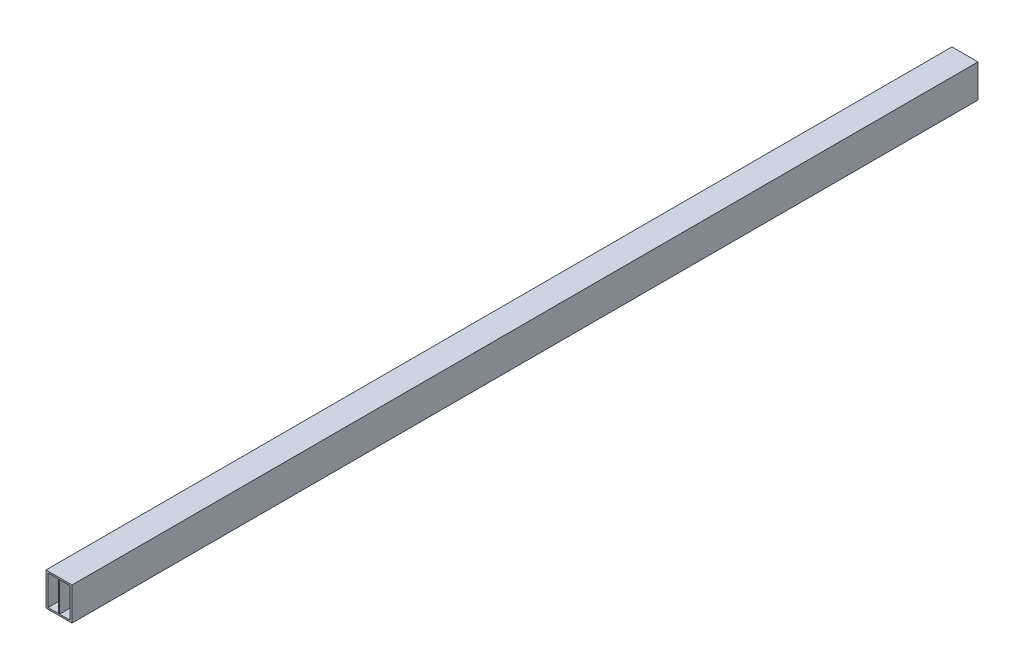
ISO-10303-21;
HEADER;
FILE_DESCRIPTION(('STEP AP214'),'2;1');
FILE_NAME('part.step','',(''),(''),'','','');
FILE_SCHEMA(('AUTOMOTIVE_DESIGN { 1 0 10303 214 1 1 1 1 }'));
ENDSEC;
DATA;
#1=APPLICATION_CONTEXT('core data for automotive mechanical design processes');
#2=APPLICATION_PROTOCOL_DEFINITION('international standard','automotive_design',2000,#1);
#3=PRODUCT_CONTEXT('',#1,'mechanical');
#4=PRODUCT('Part','Part','',(#3));
#5=PRODUCT_RELATED_PRODUCT_CATEGORY('part','',(#4));
#6=PRODUCT_DEFINITION_FORMATION('','',#4);
#7=PRODUCT_DEFINITION_CONTEXT('part definition',#1,'design');
#8=PRODUCT_DEFINITION('design','',#6,#7);
#9=PRODUCT_DEFINITION_SHAPE('','',#8);
#10=(LENGTH_UNIT() NAMED_UNIT(*) SI_UNIT(.MILLI.,.METRE.));
#11=(NAMED_UNIT(*) PLANE_ANGLE_UNIT() SI_UNIT($,.RADIAN.));
#12=(NAMED_UNIT(*) SI_UNIT($,.STERADIAN.) SOLID_ANGLE_UNIT());
#13=UNCERTAINTY_MEASURE_WITH_UNIT(LENGTH_MEASURE(1.E-05),#10,'distance_accuracy_value','');
#14=(GEOMETRIC_REPRESENTATION_CONTEXT(3) GLOBAL_UNCERTAINTY_ASSIGNED_CONTEXT((#13)) GLOBAL_UNIT_ASSIGNED_CONTEXT((#10,
#11,#12)) REPRESENTATION_CONTEXT('',''));
#15=CARTESIAN_POINT('',(0.,0.,0.));
#16=DIRECTION('',(0.,0.,1.));
#17=DIRECTION('',(1.,0.,0.));
#18=AXIS2_PLACEMENT_3D('',#15,#16,#17);
#19=CARTESIAN_POINT('',(47.5660357142857,-7.11224053295814,4200.));
#20=DIRECTION('',(0.,1.,0.));
#21=DIRECTION('',(-1.,0.,0.));
#22=AXIS2_PLACEMENT_3D('',#19,#20,#21);
#23=PLANE('',#22);
#24=DIRECTION('',(1.,0.,0.));
#25=VECTOR('',#24,1.);
#26=CARTESIAN_POINT('',(47.5660357142857,-7.11224053295814,0.));
#27=LINE('',#26,#25);
#28=CARTESIAN_POINT('',(0.,-7.1122405329582,0.));
#29=VERTEX_POINT('',#28);
#30=CARTESIAN_POINT('',(47.5660357142857,-7.11224053295814,0.));
#31=VERTEX_POINT('',#30);
#32=EDGE_CURVE('E179',#29,#31,#27,.T.);
#33=ORIENTED_EDGE('',*,*,#32,.T.);
#34=DIRECTION('',(0.,0.,-1.));
#35=VECTOR('',#34,1.);
#36=CARTESIAN_POINT('',(47.5660357142857,-7.11224053295814,4200.));
#37=LINE('',#36,#35);
#38=CARTESIAN_POINT('',(47.5660357142857,-7.11224053295814,4200.));
#39=VERTEX_POINT('',#38);
#40=EDGE_CURVE('E228',#39,#31,#37,.T.);
#41=ORIENTED_EDGE('',*,*,#40,.F.);
#42=DIRECTION('',(1.,0.,0.));
#43=VECTOR('',#42,1.);
#44=CARTESIAN_POINT('',(47.5660357142857,-7.11224053295814,4200.));
#45=LINE('',#44,#43);
#46=CARTESIAN_POINT('',(0.,-7.11224053295814,4200.));
#47=VERTEX_POINT('',#46);
#48=EDGE_CURVE('E184',#47,#39,#45,.T.);
#49=ORIENTED_EDGE('',*,*,#48,.F.);
#50=DIRECTION('',(0.,0.,-1.));
#51=VECTOR('',#50,1.);
#52=CARTESIAN_POINT('',(0.,-7.11224053295814,4200.));
#53=LINE('',#52,#51);
#54=EDGE_CURVE('E231',#47,#29,#53,.T.);
#55=ORIENTED_EDGE('',*,*,#54,.T.);
#56=EDGE_LOOP('',(#33,#41,#49,#55));
#57=FACE_BOUND('',#56,.T.);
#58=ADVANCED_FACE('F37',(#57),#23,.F.);
#59=CARTESIAN_POINT('',(47.5660357142857,-146.050240532958,4200.));
#60=DIRECTION('',(1.,0.,0.));
#61=DIRECTION('',(0.,0.,-1.));
#62=AXIS2_PLACEMENT_3D('',#59,#60,#61);
#63=PLANE('',#62);
#64=DIRECTION('',(0.,-1.,0.));
#65=VECTOR('',#64,1.);
#66=CARTESIAN_POINT('',(47.5660357142857,-146.050240532958,0.));
#67=LINE('',#66,#65);
#68=CARTESIAN_POINT('',(47.5660357142857,-146.050240532958,0.));
#69=VERTEX_POINT('',#68);
#70=EDGE_CURVE('E202',#31,#69,#67,.T.);
#71=ORIENTED_EDGE('',*,*,#70,.T.);
#72=DIRECTION('',(0.,0.,-1.));
#73=VECTOR('',#72,1.);
#74=CARTESIAN_POINT('',(47.5660357142857,-146.050240532958,4200.));
#75=LINE('',#74,#73);
#76=CARTESIAN_POINT('',(47.5660357142857,-146.050240532958,4200.));
#77=VERTEX_POINT('',#76);
#78=EDGE_CURVE('E225',#77,#69,#75,.T.);
#79=ORIENTED_EDGE('',*,*,#78,.F.);
#80=DIRECTION('',(0.,-1.,0.));
#81=VECTOR('',#80,1.);
#82=CARTESIAN_POINT('',(47.5660357142857,-146.050240532958,4200.));
#83=LINE('',#82,#81);
#84=EDGE_CURVE('E186',#39,#77,#83,.T.);
#85=ORIENTED_EDGE('',*,*,#84,.F.);
#86=ORIENTED_EDGE('',*,*,#40,.T.);
#87=EDGE_LOOP('',(#71,#79,#85,#86));
#88=FACE_BOUND('',#87,.T.);
#89=ADVANCED_FACE('F248',(#88),#63,.F.);
#90=CARTESIAN_POINT('',(0.,-146.050240532958,4200.));
#91=DIRECTION('',(0.,-1.,0.));
#92=DIRECTION('',(1.,0.,0.));
#93=AXIS2_PLACEMENT_3D('',#90,#91,#92);
#94=PLANE('',#93);
#95=DIRECTION('',(-1.,0.,0.));
#96=VECTOR('',#95,1.);
#97=CARTESIAN_POINT('',(0.,-146.050240532958,0.));
#98=LINE('',#97,#96);
#99=CARTESIAN_POINT('',(0.,-146.050240532958,0.));
#100=VERTEX_POINT('',#99);
#101=EDGE_CURVE('E143',#69,#100,#98,.T.);
#102=ORIENTED_EDGE('',*,*,#101,.T.);
#103=DIRECTION('',(0.,0.,-1.));
#104=VECTOR('',#103,1.);
#105=CARTESIAN_POINT('',(0.,-146.050240532958,4200.));
#106=LINE('',#105,#104);
#107=CARTESIAN_POINT('',(0.,-146.050240532958,4200.));
#108=VERTEX_POINT('',#107);
#109=EDGE_CURVE('E222',#108,#100,#106,.T.);
#110=ORIENTED_EDGE('',*,*,#109,.F.);
#111=DIRECTION('',(-1.,0.,0.));
#112=VECTOR('',#111,1.);
#113=CARTESIAN_POINT('',(0.,-146.050240532958,4200.));
#114=LINE('',#113,#112);
#115=EDGE_CURVE('E189',#77,#108,#114,.T.);
#116=ORIENTED_EDGE('',*,*,#115,.F.);
#117=ORIENTED_EDGE('',*,*,#78,.T.);
#118=EDGE_LOOP('',(#102,#110,#116,#117));
#119=FACE_BOUND('',#118,.T.);
#120=ADVANCED_FACE('F237',(#119),#94,.F.);
#121=CARTESIAN_POINT('',(101.6,-153.162240532958,4200.));
#122=DIRECTION('',(0.,1.,0.));
#123=DIRECTION('',(0.,0.,1.));
#124=AXIS2_PLACEMENT_3D('',#121,#122,#123);
#125=PLANE('',#124);
#126=DIRECTION('',(-1.,0.,0.));
#127=VECTOR('',#126,1.);
#128=CARTESIAN_POINT('',(101.6,-153.162240532958,2252.4));
#129=LINE('',#128,#127);
#130=CARTESIAN_POINT('',(101.6,-153.162240532958,2252.4));
#131=VERTEX_POINT('',#130);
#132=CARTESIAN_POINT('',(0.,-153.162240532958,2252.4));
#133=VERTEX_POINT('',#132);
#134=EDGE_CURVE('E11',#131,#133,#129,.T.);
#135=ORIENTED_EDGE('',*,*,#134,.T.);
#136=ORIENTED_EDGE('',*,*,#134,.F.);
#137=EDGE_LOOP('',(#135,#136));
#138=FACE_BOUND('',#137,.T.);
#139=DIRECTION('',(1.,0.,0.));
#140=VECTOR('',#139,1.);
#141=CARTESIAN_POINT('',(101.6,-153.162240532958,1947.6));
#142=LINE('',#141,#140);
#143=CARTESIAN_POINT('',(0.,-153.162240532958,1947.6));
#144=VERTEX_POINT('',#143);
#145=CARTESIAN_POINT('',(101.6,-153.162240532958,1947.6));
#146=VERTEX_POINT('',#145);
#147=EDGE_CURVE('E45',#144,#146,#142,.T.);
#148=ORIENTED_EDGE('',*,*,#147,.F.);
#149=ORIENTED_EDGE('',*,*,#147,.T.);
#150=EDGE_LOOP('',(#148,#149));
#151=FACE_BOUND('',#150,.T.);
#152=DIRECTION('',(0.,0.,-1.));
#153=VECTOR('',#152,1.);
#154=CARTESIAN_POINT('',(111.125,-153.162240532958,4200.));
#155=LINE('',#154,#153);
#156=CARTESIAN_POINT('',(111.125,-153.162240532958,4200.));
#157=VERTEX_POINT('',#156);
#158=CARTESIAN_POINT('',(111.125,-153.162240532958,0.));
#159=VERTEX_POINT('',#158);
#160=EDGE_CURVE('E172',#157,#159,#155,.T.);
#161=ORIENTED_EDGE('',*,*,#160,.F.);
#162=DIRECTION('',(1.,0.,0.));
#163=VECTOR('',#162,1.);
#164=CARTESIAN_POINT('',(101.6,-153.162240532958,4200.));
#165=LINE('',#164,#163);
#166=CARTESIAN_POINT('',(-9.525,-153.162240532958,4200.));
#167=VERTEX_POINT('',#166);
#168=EDGE_CURVE('E148',#167,#157,#165,.T.);
#169=ORIENTED_EDGE('',*,*,#168,.F.);
#170=DIRECTION('',(0.,0.,1.));
#171=VECTOR('',#170,1.);
#172=CARTESIAN_POINT('',(-9.525,-153.162240532958,0.));
#173=LINE('',#172,#171);
#174=CARTESIAN_POINT('',(-9.525,-153.162240532958,0.));
#175=VERTEX_POINT('',#174);
#176=EDGE_CURVE('E146',#175,#167,#173,.T.);
#177=ORIENTED_EDGE('',*,*,#176,.F.);
#178=DIRECTION('',(1.,0.,0.));
#179=VECTOR('',#178,1.);
#180=CARTESIAN_POINT('',(101.6,-153.162240532958,0.));
#181=LINE('',#180,#179);
#182=EDGE_CURVE('E131',#175,#159,#181,.T.);
#183=ORIENTED_EDGE('',*,*,#182,.T.);
#184=EDGE_LOOP('',(#161,#169,#177,#183));
#185=FACE_BOUND('',#184,.T.);
#186=ADVANCED_FACE('F147',(#138,#151,#185),#125,.F.);
#187=CARTESIAN_POINT('',(53.4080357142857,-146.050240532958,4200.));
#188=DIRECTION('',(0.,-1.,0.));
#189=DIRECTION('',(1.,0.,0.));
#190=AXIS2_PLACEMENT_3D('',#187,#188,#189);
#191=PLANE('',#190);
#192=DIRECTION('',(-1.,0.,0.));
#193=VECTOR('',#192,1.);
#194=CARTESIAN_POINT('',(53.4080357142857,-146.050240532958,0.));
#195=LINE('',#194,#193);
#196=CARTESIAN_POINT('',(101.6,-146.050240532958,0.));
#197=VERTEX_POINT('',#196);
#198=CARTESIAN_POINT('',(53.4080357142857,-146.050240532958,0.));
#199=VERTEX_POINT('',#198);
#200=EDGE_CURVE('E142',#197,#199,#195,.T.);
#201=ORIENTED_EDGE('',*,*,#200,.T.);
#202=DIRECTION('',(0.,0.,-1.));
#203=VECTOR('',#202,1.);
#204=CARTESIAN_POINT('',(53.4080357142857,-146.050240532958,4200.));
#205=LINE('',#204,#203);
#206=CARTESIAN_POINT('',(53.4080357142857,-146.050240532958,4200.));
#207=VERTEX_POINT('',#206);
#208=EDGE_CURVE('E216',#207,#199,#205,.T.);
#209=ORIENTED_EDGE('',*,*,#208,.F.);
#210=DIRECTION('',(-1.,0.,0.));
#211=VECTOR('',#210,1.);
#212=CARTESIAN_POINT('',(53.4080357142857,-146.050240532958,4200.));
#213=LINE('',#212,#211);
#214=CARTESIAN_POINT('',(101.6,-146.050240532958,4200.));
#215=VERTEX_POINT('',#214);
#216=EDGE_CURVE('E192',#215,#207,#213,.T.);
#217=ORIENTED_EDGE('',*,*,#216,.F.);
#218=DIRECTION('',(0.,0.,-1.));
#219=VECTOR('',#218,1.);
#220=CARTESIAN_POINT('',(101.6,-146.050240532958,4200.));
#221=LINE('',#220,#219);
#222=EDGE_CURVE('E219',#215,#197,#221,.T.);
#223=ORIENTED_EDGE('',*,*,#222,.T.);
#224=EDGE_LOOP('',(#201,#209,#217,#223));
#225=FACE_BOUND('',#224,.T.);
#226=ADVANCED_FACE('F236',(#225),#191,.F.);
#227=CARTESIAN_POINT('',(53.4080357142857,-7.11224053295815,4200.));
#228=DIRECTION('',(-1.,0.,0.));
#229=DIRECTION('',(0.,-1.,0.));
#230=AXIS2_PLACEMENT_3D('',#227,#228,#229);
#231=PLANE('',#230);
#232=DIRECTION('',(0.,1.,0.));
#233=VECTOR('',#232,1.);
#234=CARTESIAN_POINT('',(53.4080357142857,-7.11224053295815,0.));
#235=LINE('',#234,#233);
#236=CARTESIAN_POINT('',(53.4080357142857,-7.11224053295815,0.));
#237=VERTEX_POINT('',#236);
#238=EDGE_CURVE('E206',#199,#237,#235,.T.);
#239=ORIENTED_EDGE('',*,*,#238,.T.);
#240=DIRECTION('',(0.,0.,-1.));
#241=VECTOR('',#240,1.);
#242=CARTESIAN_POINT('',(53.4080357142857,-7.11224053295815,4200.));
#243=LINE('',#242,#241);
#244=CARTESIAN_POINT('',(53.4080357142857,-7.11224053295815,4200.));
#245=VERTEX_POINT('',#244);
#246=EDGE_CURVE('E213',#245,#237,#243,.T.);
#247=ORIENTED_EDGE('',*,*,#246,.F.);
#248=DIRECTION('',(0.,1.,0.));
#249=VECTOR('',#248,1.);
#250=CARTESIAN_POINT('',(53.4080357142857,-7.11224053295815,4200.));
#251=LINE('',#250,#249);
#252=EDGE_CURVE('E194',#207,#245,#251,.T.);
#253=ORIENTED_EDGE('',*,*,#252,.F.);
#254=ORIENTED_EDGE('',*,*,#208,.T.);
#255=EDGE_LOOP('',(#239,#247,#253,#254));
#256=FACE_BOUND('',#255,.T.);
#257=ADVANCED_FACE('F244',(#256),#231,.F.);
#258=CARTESIAN_POINT('',(101.6,-7.11224053295814,4200.));
#259=DIRECTION('',(0.,1.,0.));
#260=DIRECTION('',(-1.,0.,0.));
#261=AXIS2_PLACEMENT_3D('',#258,#259,#260);
#262=PLANE('',#261);
#263=DIRECTION('',(1.,0.,0.));
#264=VECTOR('',#263,1.);
#265=CARTESIAN_POINT('',(101.6,-7.11224053295814,0.));
#266=LINE('',#265,#264);
#267=CARTESIAN_POINT('',(101.6,-7.11224053295814,0.));
#268=VERTEX_POINT('',#267);
#269=EDGE_CURVE('E208',#237,#268,#266,.T.);
#270=ORIENTED_EDGE('',*,*,#269,.T.);
#271=DIRECTION('',(0.,0.,-1.));
#272=VECTOR('',#271,1.);
#273=CARTESIAN_POINT('',(101.6,-7.11224053295814,4200.));
#274=LINE('',#273,#272);
#275=CARTESIAN_POINT('',(101.6,-7.11224053295814,4200.));
#276=VERTEX_POINT('',#275);
#277=EDGE_CURVE('E200',#276,#268,#274,.T.);
#278=ORIENTED_EDGE('',*,*,#277,.F.);
#279=DIRECTION('',(1.,0.,0.));
#280=VECTOR('',#279,1.);
#281=CARTESIAN_POINT('',(101.6,-7.11224053295814,4200.));
#282=LINE('',#281,#280);
#283=EDGE_CURVE('E196',#245,#276,#282,.T.);
#284=ORIENTED_EDGE('',*,*,#283,.F.);
#285=ORIENTED_EDGE('',*,*,#246,.T.);
#286=EDGE_LOOP('',(#270,#278,#284,#285));
#287=FACE_BOUND('',#286,.T.);
#288=ADVANCED_FACE('F286',(#287),#262,.F.);
#289=CARTESIAN_POINT('',(0.,-0.000240532958142959,4200.));
#290=DIRECTION('',(0.,-1.,0.));
#291=DIRECTION('',(1.,0.,0.));
#292=AXIS2_PLACEMENT_3D('',#289,#290,#291);
#293=PLANE('',#292);
#294=DIRECTION('',(-1.,0.,0.));
#295=VECTOR('',#294,1.);
#296=CARTESIAN_POINT('',(0.,-0.000240532958142959,0.));
#297=LINE('',#296,#295);
#298=CARTESIAN_POINT('',(111.125,-0.000240532958130516,0.));
#299=VERTEX_POINT('',#298);
#300=CARTESIAN_POINT('',(-9.525,-0.000240532958142959,0.));
#301=VERTEX_POINT('',#300);
#302=EDGE_CURVE('E187',#299,#301,#297,.T.);
#303=ORIENTED_EDGE('',*,*,#302,.T.);
#304=DIRECTION('',(0.,0.,-1.));
#305=VECTOR('',#304,1.);
#306=CARTESIAN_POINT('',(-9.525,-0.000240532958142959,0.));
#307=LINE('',#306,#305);
#308=CARTESIAN_POINT('',(-9.525,-0.000240532958142959,4200.));
#309=VERTEX_POINT('',#308);
#310=EDGE_CURVE('E157',#309,#301,#307,.T.);
#311=ORIENTED_EDGE('',*,*,#310,.F.);
#312=DIRECTION('',(-1.,0.,0.));
#313=VECTOR('',#312,1.);
#314=CARTESIAN_POINT('',(0.,-0.000240532958142959,4200.));
#315=LINE('',#314,#313);
#316=CARTESIAN_POINT('',(111.125,-0.000240532958130516,4200.));
#317=VERTEX_POINT('',#316);
#318=EDGE_CURVE('E198',#317,#309,#315,.T.);
#319=ORIENTED_EDGE('',*,*,#318,.F.);
#320=DIRECTION('',(0.,0.,1.));
#321=VECTOR('',#320,1.);
#322=CARTESIAN_POINT('',(111.125,-0.000240532958130516,4200.));
#323=LINE('',#322,#321);
#324=EDGE_CURVE('E176',#299,#317,#323,.T.);
#325=ORIENTED_EDGE('',*,*,#324,.F.);
#326=EDGE_LOOP('',(#303,#311,#319,#325));
#327=FACE_BOUND('',#326,.T.);
#328=ADVANCED_FACE('F276',(#327),#293,.F.);
#329=CARTESIAN_POINT('',(0.,0.,4200.));
#330=DIRECTION('',(0.,0.,-1.));
#331=DIRECTION('',(-1.,0.,0.));
#332=AXIS2_PLACEMENT_3D('',#329,#330,#331);
#333=PLANE('',#332);
#334=DIRECTION('',(0.,1.,0.));
#335=VECTOR('',#334,1.);
#336=CARTESIAN_POINT('',(0.,-153.162240532958,4200.));
#337=LINE('',#336,#335);
#338=EDGE_CURVE('E158',#108,#47,#337,.T.);
#339=ORIENTED_EDGE('',*,*,#338,.T.);
#340=ORIENTED_EDGE('',*,*,#48,.T.);
#341=ORIENTED_EDGE('',*,*,#84,.T.);
#342=ORIENTED_EDGE('',*,*,#115,.T.);
#343=EDGE_LOOP('',(#339,#340,#341,#342));
#344=FACE_BOUND('',#343,.T.);
#345=DIRECTION('',(0.,-1.,0.));
#346=VECTOR('',#345,1.);
#347=CARTESIAN_POINT('',(111.125,-0.000240532958130516,4200.));
#348=LINE('',#347,#346);
#349=EDGE_CURVE('E169',#317,#157,#348,.T.);
#350=ORIENTED_EDGE('',*,*,#349,.F.);
#351=ORIENTED_EDGE('',*,*,#318,.T.);
#352=DIRECTION('',(0.,1.,0.));
#353=VECTOR('',#352,1.);
#354=CARTESIAN_POINT('',(-9.525,-153.162240532958,4200.));
#355=LINE('',#354,#353);
#356=EDGE_CURVE('E152',#167,#309,#355,.T.);
#357=ORIENTED_EDGE('',*,*,#356,.F.);
#358=ORIENTED_EDGE('',*,*,#168,.T.);
#359=EDGE_LOOP('',(#350,#351,#357,#358));
#360=FACE_BOUND('',#359,.T.);
#361=ORIENTED_EDGE('',*,*,#283,.T.);
#362=DIRECTION('',(0.,-1.,0.));
#363=VECTOR('',#362,1.);
#364=CARTESIAN_POINT('',(101.6,-0.000240532958130516,4200.));
#365=LINE('',#364,#363);
#366=EDGE_CURVE('E166',#276,#215,#365,.T.);
#367=ORIENTED_EDGE('',*,*,#366,.T.);
#368=ORIENTED_EDGE('',*,*,#216,.T.);
#369=ORIENTED_EDGE('',*,*,#252,.T.);
#370=EDGE_LOOP('',(#361,#367,#368,#369));
#371=FACE_BOUND('',#370,.T.);
#372=ADVANCED_FACE('F273',(#344,#360,#371),#333,.F.);
#373=CARTESIAN_POINT('',(0.,0.,0.));
#374=DIRECTION('',(0.,0.,-1.));
#375=DIRECTION('',(-1.,0.,0.));
#376=AXIS2_PLACEMENT_3D('',#373,#374,#375);
#377=PLANE('',#376);
#378=ORIENTED_EDGE('',*,*,#32,.F.);
#379=DIRECTION('',(0.,-1.,0.));
#380=VECTOR('',#379,1.);
#381=CARTESIAN_POINT('',(0.,-153.162240532958,0.));
#382=LINE('',#381,#380);
#383=EDGE_CURVE('E161',#29,#100,#382,.T.);
#384=ORIENTED_EDGE('',*,*,#383,.T.);
#385=ORIENTED_EDGE('',*,*,#101,.F.);
#386=ORIENTED_EDGE('',*,*,#70,.F.);
#387=EDGE_LOOP('',(#378,#384,#385,#386));
#388=FACE_BOUND('',#387,.T.);
#389=ORIENTED_EDGE('',*,*,#302,.F.);
#390=DIRECTION('',(0.,1.,0.));
#391=VECTOR('',#390,1.);
#392=CARTESIAN_POINT('',(111.125,-0.000240532958130516,0.));
#393=LINE('',#392,#391);
#394=EDGE_CURVE('E138',#159,#299,#393,.T.);
#395=ORIENTED_EDGE('',*,*,#394,.F.);
#396=ORIENTED_EDGE('',*,*,#182,.F.);
#397=DIRECTION('',(0.,-1.,0.));
#398=VECTOR('',#397,1.);
#399=CARTESIAN_POINT('',(-9.525,-153.162240532958,0.));
#400=LINE('',#399,#398);
#401=EDGE_CURVE('E136',#301,#175,#400,.T.);
#402=ORIENTED_EDGE('',*,*,#401,.F.);
#403=EDGE_LOOP('',(#389,#395,#396,#402));
#404=FACE_BOUND('',#403,.T.);
#405=DIRECTION('',(0.,1.,0.));
#406=VECTOR('',#405,1.);
#407=CARTESIAN_POINT('',(101.6,-0.000240532958130516,0.));
#408=LINE('',#407,#406);
#409=EDGE_CURVE('E173',#197,#268,#408,.T.);
#410=ORIENTED_EDGE('',*,*,#409,.T.);
#411=ORIENTED_EDGE('',*,*,#269,.F.);
#412=ORIENTED_EDGE('',*,*,#238,.F.);
#413=ORIENTED_EDGE('',*,*,#200,.F.);
#414=EDGE_LOOP('',(#410,#411,#412,#413));
#415=FACE_BOUND('',#414,.T.);
#416=ADVANCED_FACE('F133',(#388,#404,#415),#377,.T.);
#417=CARTESIAN_POINT('',(101.6,0.,0.));
#418=DIRECTION('',(1.,0.,0.));
#419=DIRECTION('',(0.,0.,-1.));
#420=AXIS2_PLACEMENT_3D('',#417,#418,#419);
#421=PLANE('',#420);
#422=ORIENTED_EDGE('',*,*,#409,.F.);
#423=ORIENTED_EDGE('',*,*,#222,.F.);
#424=ORIENTED_EDGE('',*,*,#366,.F.);
#425=ORIENTED_EDGE('',*,*,#277,.T.);
#426=EDGE_LOOP('',(#422,#423,#424,#425));
#427=FACE_BOUND('',#426,.T.);
#428=ADVANCED_FACE('F291',(#427),#421,.F.);
#429=CARTESIAN_POINT('',(111.125,0.,0.));
#430=DIRECTION('',(1.,0.,0.));
#431=DIRECTION('',(0.,0.,-1.));
#432=AXIS2_PLACEMENT_3D('',#429,#430,#431);
#433=PLANE('',#432);
#434=ORIENTED_EDGE('',*,*,#349,.T.);
#435=ORIENTED_EDGE('',*,*,#160,.T.);
#436=ORIENTED_EDGE('',*,*,#394,.T.);
#437=ORIENTED_EDGE('',*,*,#324,.T.);
#438=EDGE_LOOP('',(#434,#435,#436,#437));
#439=FACE_BOUND('',#438,.T.);
#440=ADVANCED_FACE('F300',(#439),#433,.T.);
#441=CARTESIAN_POINT('',(0.,0.,0.));
#442=DIRECTION('',(1.,0.,0.));
#443=DIRECTION('',(0.,0.,-1.));
#444=AXIS2_PLACEMENT_3D('',#441,#442,#443);
#445=PLANE('',#444);
#446=ORIENTED_EDGE('',*,*,#54,.F.);
#447=ORIENTED_EDGE('',*,*,#338,.F.);
#448=ORIENTED_EDGE('',*,*,#109,.T.);
#449=ORIENTED_EDGE('',*,*,#383,.F.);
#450=EDGE_LOOP('',(#446,#447,#448,#449));
#451=FACE_BOUND('',#450,.T.);
#452=ADVANCED_FACE('F271',(#451),#445,.T.);
#453=CARTESIAN_POINT('',(-9.525,0.,0.));
#454=DIRECTION('',(1.,0.,0.));
#455=DIRECTION('',(0.,0.,-1.));
#456=AXIS2_PLACEMENT_3D('',#453,#454,#455);
#457=PLANE('',#456);
#458=ORIENTED_EDGE('',*,*,#401,.T.);
#459=ORIENTED_EDGE('',*,*,#176,.T.);
#460=ORIENTED_EDGE('',*,*,#356,.T.);
#461=ORIENTED_EDGE('',*,*,#310,.T.);
#462=EDGE_LOOP('',(#458,#459,#460,#461));
#463=FACE_BOUND('',#462,.T.);
#464=ADVANCED_FACE('F155',(#463),#457,.F.);
#465=CLOSED_SHELL('',(#58,#89,#120,#186,#226,#257,#288,#328,#372,#416,#428,#440,#452,#464));
#466=MANIFOLD_SOLID_BREP('B2',#465);
#467=ADVANCED_BREP_SHAPE_REPRESENTATION('',(#18,#466),#14);
#468=SHAPE_DEFINITION_REPRESENTATION(#9,#467);
ENDSEC;
END-ISO-10303-21;
